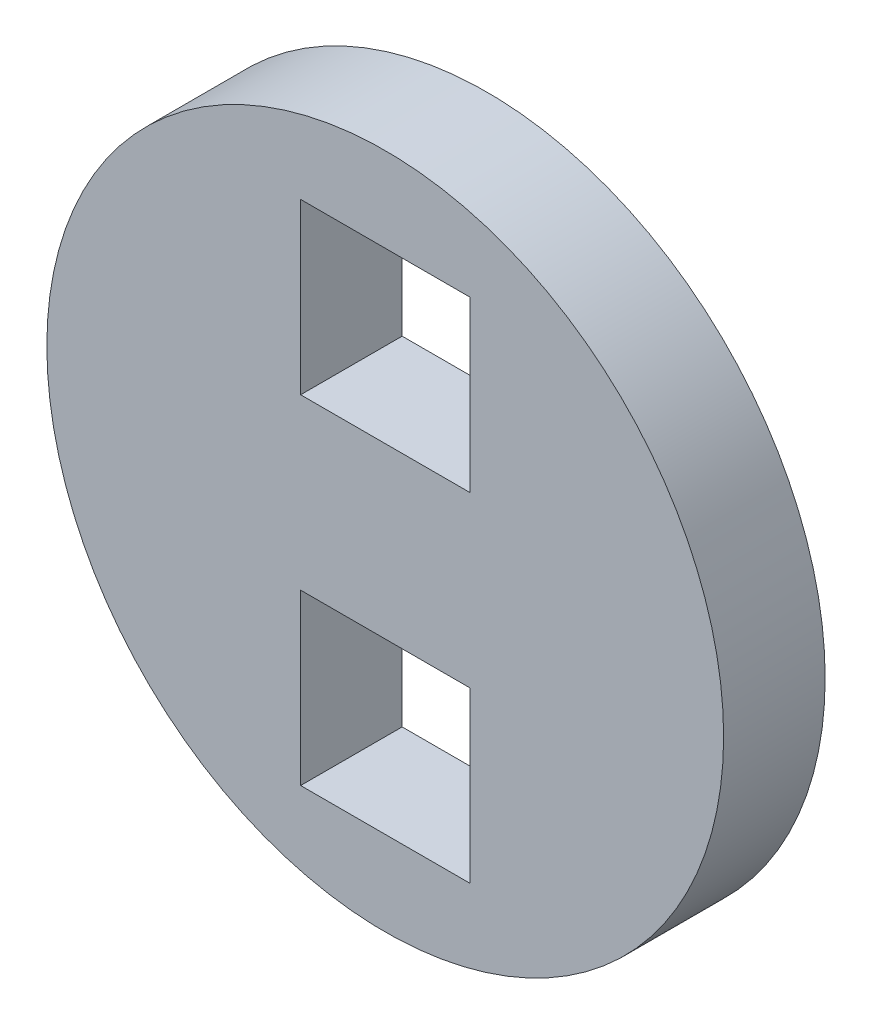
ISO-10303-21;
HEADER;
FILE_DESCRIPTION(('STEP AP214'),'2;1');
FILE_NAME('part.step','',(''),(''),'','','');
FILE_SCHEMA(('AUTOMOTIVE_DESIGN { 1 0 10303 214 1 1 1 1 }'));
ENDSEC;
DATA;
#1=APPLICATION_CONTEXT('core data for automotive mechanical design processes');
#2=APPLICATION_PROTOCOL_DEFINITION('international standard','automotive_design',2000,#1);
#3=PRODUCT_CONTEXT('',#1,'mechanical');
#4=PRODUCT('Part','Part','',(#3));
#5=PRODUCT_RELATED_PRODUCT_CATEGORY('part','',(#4));
#6=PRODUCT_DEFINITION_FORMATION('','',#4);
#7=PRODUCT_DEFINITION_CONTEXT('part definition',#1,'design');
#8=PRODUCT_DEFINITION('design','',#6,#7);
#9=PRODUCT_DEFINITION_SHAPE('','',#8);
#10=(LENGTH_UNIT() NAMED_UNIT(*) SI_UNIT(.MILLI.,.METRE.));
#11=(NAMED_UNIT(*) PLANE_ANGLE_UNIT() SI_UNIT($,.RADIAN.));
#12=(NAMED_UNIT(*) SI_UNIT($,.STERADIAN.) SOLID_ANGLE_UNIT());
#13=UNCERTAINTY_MEASURE_WITH_UNIT(LENGTH_MEASURE(1.E-05),#10,'distance_accuracy_value','');
#14=(GEOMETRIC_REPRESENTATION_CONTEXT(3) GLOBAL_UNCERTAINTY_ASSIGNED_CONTEXT((#13)) GLOBAL_UNIT_ASSIGNED_CONTEXT((#10,
#11,#12)) REPRESENTATION_CONTEXT('',''));
#15=CARTESIAN_POINT('',(0.,0.,0.));
#16=DIRECTION('',(0.,0.,1.));
#17=DIRECTION('',(1.,0.,0.));
#18=AXIS2_PLACEMENT_3D('',#15,#16,#17);
#19=CARTESIAN_POINT('',(0.,0.,3.));
#20=DIRECTION('',(0.,0.,1.));
#21=DIRECTION('',(1.,0.,0.));
#22=AXIS2_PLACEMENT_3D('',#19,#20,#21);
#23=PLANE('',#22);
#24=CARTESIAN_POINT('',(0.,0.,3.));
#25=DIRECTION('',(0.,0.,1.));
#26=DIRECTION('',(1.,0.,0.));
#27=AXIS2_PLACEMENT_3D('',#24,#25,#26);
#28=CIRCLE('',#27,10.);
#29=CARTESIAN_POINT('',(10.,0.,3.));
#30=VERTEX_POINT('',#29);
#31=EDGE_CURVE('E11',#30,#30,#28,.T.);
#32=ORIENTED_EDGE('',*,*,#31,.T.);
#33=EDGE_LOOP('',(#32));
#34=FACE_BOUND('',#33,.T.);
#35=DIRECTION('',(0.,-1.,0.));
#36=VECTOR('',#35,1.);
#37=CARTESIAN_POINT('',(-2.5,-2.5,3.));
#38=LINE('',#37,#36);
#39=CARTESIAN_POINT('',(-2.5,-2.5,3.));
#40=VERTEX_POINT('',#39);
#41=CARTESIAN_POINT('',(-2.5,-7.5,3.));
#42=VERTEX_POINT('',#41);
#43=EDGE_CURVE('E140',#40,#42,#38,.T.);
#44=ORIENTED_EDGE('',*,*,#43,.F.);
#45=DIRECTION('',(-1.,0.,0.));
#46=VECTOR('',#45,1.);
#47=CARTESIAN_POINT('',(-2.5,-2.5,3.));
#48=LINE('',#47,#46);
#49=CARTESIAN_POINT('',(2.5,-2.5,3.));
#50=VERTEX_POINT('',#49);
#51=EDGE_CURVE('E138',#50,#40,#48,.T.);
#52=ORIENTED_EDGE('',*,*,#51,.F.);
#53=DIRECTION('',(0.,1.,0.));
#54=VECTOR('',#53,1.);
#55=CARTESIAN_POINT('',(2.5,-2.5,3.));
#56=LINE('',#55,#54);
#57=CARTESIAN_POINT('',(2.5,-7.5,3.));
#58=VERTEX_POINT('',#57);
#59=EDGE_CURVE('E146',#58,#50,#56,.T.);
#60=ORIENTED_EDGE('',*,*,#59,.F.);
#61=DIRECTION('',(1.,0.,0.));
#62=VECTOR('',#61,1.);
#63=CARTESIAN_POINT('',(-2.5,-7.5,3.));
#64=LINE('',#63,#62);
#65=EDGE_CURVE('E143',#42,#58,#64,.T.);
#66=ORIENTED_EDGE('',*,*,#65,.F.);
#67=EDGE_LOOP('',(#44,#52,#60,#66));
#68=FACE_BOUND('',#67,.T.);
#69=DIRECTION('',(0.,1.,0.));
#70=VECTOR('',#69,1.);
#71=CARTESIAN_POINT('',(2.5,2.5,3.));
#72=LINE('',#71,#70);
#73=CARTESIAN_POINT('',(2.5,2.5,3.));
#74=VERTEX_POINT('',#73);
#75=CARTESIAN_POINT('',(2.5,7.5,3.));
#76=VERTEX_POINT('',#75);
#77=EDGE_CURVE('E110',#74,#76,#72,.T.);
#78=ORIENTED_EDGE('',*,*,#77,.F.);
#79=DIRECTION('',(1.,0.,0.));
#80=VECTOR('',#79,1.);
#81=CARTESIAN_POINT('',(-2.5,2.5,3.));
#82=LINE('',#81,#80);
#83=CARTESIAN_POINT('',(-2.5,2.5,3.));
#84=VERTEX_POINT('',#83);
#85=EDGE_CURVE('E102',#84,#74,#82,.T.);
#86=ORIENTED_EDGE('',*,*,#85,.F.);
#87=DIRECTION('',(0.,-1.,0.));
#88=VECTOR('',#87,1.);
#89=CARTESIAN_POINT('',(-2.5,2.5,3.));
#90=LINE('',#89,#88);
#91=CARTESIAN_POINT('',(-2.5,7.5,3.));
#92=VERTEX_POINT('',#91);
#93=EDGE_CURVE('E124',#92,#84,#90,.T.);
#94=ORIENTED_EDGE('',*,*,#93,.F.);
#95=DIRECTION('',(-1.,0.,0.));
#96=VECTOR('',#95,1.);
#97=CARTESIAN_POINT('',(-2.5,7.5,3.));
#98=LINE('',#97,#96);
#99=EDGE_CURVE('E122',#76,#92,#98,.T.);
#100=ORIENTED_EDGE('',*,*,#99,.F.);
#101=EDGE_LOOP('',(#78,#86,#94,#100));
#102=FACE_BOUND('',#101,.T.);
#103=ADVANCED_FACE('F37',(#34,#68,#102),#23,.T.);
#104=CARTESIAN_POINT('',(0.,0.,0.));
#105=DIRECTION('',(0.,0.,1.));
#106=DIRECTION('',(1.,0.,0.));
#107=AXIS2_PLACEMENT_3D('',#104,#105,#106);
#108=PLANE('',#107);
#109=DIRECTION('',(-1.,0.,0.));
#110=VECTOR('',#109,1.);
#111=CARTESIAN_POINT('',(-2.5,-2.5,0.));
#112=LINE('',#111,#110);
#113=CARTESIAN_POINT('',(2.5,-2.5,0.));
#114=VERTEX_POINT('',#113);
#115=CARTESIAN_POINT('',(-2.5,-2.5,0.));
#116=VERTEX_POINT('',#115);
#117=EDGE_CURVE('E118',#114,#116,#112,.T.);
#118=ORIENTED_EDGE('',*,*,#117,.T.);
#119=DIRECTION('',(0.,-1.,0.));
#120=VECTOR('',#119,1.);
#121=CARTESIAN_POINT('',(-2.5,-2.5,0.));
#122=LINE('',#121,#120);
#123=CARTESIAN_POINT('',(-2.5,-7.5,0.));
#124=VERTEX_POINT('',#123);
#125=EDGE_CURVE('E151',#116,#124,#122,.T.);
#126=ORIENTED_EDGE('',*,*,#125,.T.);
#127=DIRECTION('',(1.,0.,0.));
#128=VECTOR('',#127,1.);
#129=CARTESIAN_POINT('',(-2.5,-7.5,0.));
#130=LINE('',#129,#128);
#131=CARTESIAN_POINT('',(2.5,-7.5,0.));
#132=VERTEX_POINT('',#131);
#133=EDGE_CURVE('E154',#124,#132,#130,.T.);
#134=ORIENTED_EDGE('',*,*,#133,.T.);
#135=DIRECTION('',(0.,1.,0.));
#136=VECTOR('',#135,1.);
#137=CARTESIAN_POINT('',(2.5,-2.5,0.));
#138=LINE('',#137,#136);
#139=EDGE_CURVE('E141',#132,#114,#138,.T.);
#140=ORIENTED_EDGE('',*,*,#139,.T.);
#141=EDGE_LOOP('',(#118,#126,#134,#140));
#142=FACE_BOUND('',#141,.T.);
#143=CARTESIAN_POINT('',(0.,0.,0.));
#144=DIRECTION('',(0.,0.,1.));
#145=DIRECTION('',(1.,0.,0.));
#146=AXIS2_PLACEMENT_3D('',#143,#144,#145);
#147=CIRCLE('',#146,10.);
#148=CARTESIAN_POINT('',(10.,0.,0.));
#149=VERTEX_POINT('',#148);
#150=EDGE_CURVE('E41',#149,#149,#147,.T.);
#151=ORIENTED_EDGE('',*,*,#150,.F.);
#152=EDGE_LOOP('',(#151));
#153=FACE_BOUND('',#152,.T.);
#154=DIRECTION('',(1.,0.,0.));
#155=VECTOR('',#154,1.);
#156=CARTESIAN_POINT('',(-2.5,2.5,0.));
#157=LINE('',#156,#155);
#158=CARTESIAN_POINT('',(-2.5,2.5,0.));
#159=VERTEX_POINT('',#158);
#160=CARTESIAN_POINT('',(2.5,2.5,0.));
#161=VERTEX_POINT('',#160);
#162=EDGE_CURVE('E60',#159,#161,#157,.T.);
#163=ORIENTED_EDGE('',*,*,#162,.T.);
#164=DIRECTION('',(0.,1.,0.));
#165=VECTOR('',#164,1.);
#166=CARTESIAN_POINT('',(2.5,2.5,0.));
#167=LINE('',#166,#165);
#168=CARTESIAN_POINT('',(2.5,7.5,0.));
#169=VERTEX_POINT('',#168);
#170=EDGE_CURVE('E117',#161,#169,#167,.T.);
#171=ORIENTED_EDGE('',*,*,#170,.T.);
#172=DIRECTION('',(-1.,0.,0.));
#173=VECTOR('',#172,1.);
#174=CARTESIAN_POINT('',(-2.5,7.5,0.));
#175=LINE('',#174,#173);
#176=CARTESIAN_POINT('',(-2.5,7.5,0.));
#177=VERTEX_POINT('',#176);
#178=EDGE_CURVE('E130',#169,#177,#175,.T.);
#179=ORIENTED_EDGE('',*,*,#178,.T.);
#180=DIRECTION('',(0.,-1.,0.));
#181=VECTOR('',#180,1.);
#182=CARTESIAN_POINT('',(-2.5,2.5,0.));
#183=LINE('',#182,#181);
#184=EDGE_CURVE('E111',#177,#159,#183,.T.);
#185=ORIENTED_EDGE('',*,*,#184,.T.);
#186=EDGE_LOOP('',(#163,#171,#179,#185));
#187=FACE_BOUND('',#186,.T.);
#188=ADVANCED_FACE('F173',(#142,#153,#187),#108,.F.);
#189=CARTESIAN_POINT('',(0.,0.,3.));
#190=DIRECTION('',(0.,0.,-1.));
#191=DIRECTION('',(-1.,0.,0.));
#192=AXIS2_PLACEMENT_3D('',#189,#190,#191);
#193=CYLINDRICAL_SURFACE('',#192,10.);
#194=ORIENTED_EDGE('',*,*,#31,.F.);
#195=EDGE_LOOP('',(#194));
#196=FACE_BOUND('',#195,.T.);
#197=ORIENTED_EDGE('',*,*,#150,.T.);
#198=EDGE_LOOP('',(#197));
#199=FACE_BOUND('',#198,.T.);
#200=ADVANCED_FACE('F39',(#196,#199),#193,.T.);
#201=CARTESIAN_POINT('',(-2.5,-2.5,3.));
#202=DIRECTION('',(0.,-1.,0.));
#203=DIRECTION('',(1.,0.,0.));
#204=AXIS2_PLACEMENT_3D('',#201,#202,#203);
#205=PLANE('',#204);
#206=ORIENTED_EDGE('',*,*,#117,.F.);
#207=DIRECTION('',(0.,0.,-1.));
#208=VECTOR('',#207,1.);
#209=CARTESIAN_POINT('',(2.5,-2.5,3.));
#210=LINE('',#209,#208);
#211=EDGE_CURVE('E148',#50,#114,#210,.T.);
#212=ORIENTED_EDGE('',*,*,#211,.F.);
#213=ORIENTED_EDGE('',*,*,#51,.T.);
#214=DIRECTION('',(0.,0.,-1.));
#215=VECTOR('',#214,1.);
#216=CARTESIAN_POINT('',(-2.5,-2.5,3.));
#217=LINE('',#216,#215);
#218=EDGE_CURVE('E165',#40,#116,#217,.T.);
#219=ORIENTED_EDGE('',*,*,#218,.T.);
#220=EDGE_LOOP('',(#206,#212,#213,#219));
#221=FACE_BOUND('',#220,.T.);
#222=ADVANCED_FACE('F194',(#221),#205,.T.);
#223=CARTESIAN_POINT('',(-2.5,-2.5,3.));
#224=DIRECTION('',(1.,0.,0.));
#225=DIRECTION('',(0.,0.,-1.));
#226=AXIS2_PLACEMENT_3D('',#223,#224,#225);
#227=PLANE('',#226);
#228=ORIENTED_EDGE('',*,*,#125,.F.);
#229=ORIENTED_EDGE('',*,*,#218,.F.);
#230=ORIENTED_EDGE('',*,*,#43,.T.);
#231=DIRECTION('',(0.,0.,-1.));
#232=VECTOR('',#231,1.);
#233=CARTESIAN_POINT('',(-2.5,-7.5,3.));
#234=LINE('',#233,#232);
#235=EDGE_CURVE('E163',#42,#124,#234,.T.);
#236=ORIENTED_EDGE('',*,*,#235,.T.);
#237=EDGE_LOOP('',(#228,#229,#230,#236));
#238=FACE_BOUND('',#237,.T.);
#239=ADVANCED_FACE('F197',(#238),#227,.T.);
#240=CARTESIAN_POINT('',(-2.5,-7.5,3.));
#241=DIRECTION('',(0.,1.,0.));
#242=DIRECTION('',(0.,0.,1.));
#243=AXIS2_PLACEMENT_3D('',#240,#241,#242);
#244=PLANE('',#243);
#245=ORIENTED_EDGE('',*,*,#133,.F.);
#246=ORIENTED_EDGE('',*,*,#235,.F.);
#247=ORIENTED_EDGE('',*,*,#65,.T.);
#248=DIRECTION('',(0.,0.,-1.));
#249=VECTOR('',#248,1.);
#250=CARTESIAN_POINT('',(2.5,-7.5,3.));
#251=LINE('',#250,#249);
#252=EDGE_CURVE('E161',#58,#132,#251,.T.);
#253=ORIENTED_EDGE('',*,*,#252,.T.);
#254=EDGE_LOOP('',(#245,#246,#247,#253));
#255=FACE_BOUND('',#254,.T.);
#256=ADVANCED_FACE('F200',(#255),#244,.T.);
#257=CARTESIAN_POINT('',(2.5,-2.5,3.));
#258=DIRECTION('',(-1.,0.,0.));
#259=DIRECTION('',(0.,0.,1.));
#260=AXIS2_PLACEMENT_3D('',#257,#258,#259);
#261=PLANE('',#260);
#262=ORIENTED_EDGE('',*,*,#139,.F.);
#263=ORIENTED_EDGE('',*,*,#252,.F.);
#264=ORIENTED_EDGE('',*,*,#59,.T.);
#265=ORIENTED_EDGE('',*,*,#211,.T.);
#266=EDGE_LOOP('',(#262,#263,#264,#265));
#267=FACE_BOUND('',#266,.T.);
#268=ADVANCED_FACE('F204',(#267),#261,.T.);
#269=CARTESIAN_POINT('',(-2.5,2.5,3.));
#270=DIRECTION('',(0.,1.,0.));
#271=DIRECTION('',(0.,0.,1.));
#272=AXIS2_PLACEMENT_3D('',#269,#270,#271);
#273=PLANE('',#272);
#274=ORIENTED_EDGE('',*,*,#162,.F.);
#275=DIRECTION('',(0.,0.,-1.));
#276=VECTOR('',#275,1.);
#277=CARTESIAN_POINT('',(-2.5,2.5,3.));
#278=LINE('',#277,#276);
#279=EDGE_CURVE('E106',#84,#159,#278,.T.);
#280=ORIENTED_EDGE('',*,*,#279,.F.);
#281=ORIENTED_EDGE('',*,*,#85,.T.);
#282=DIRECTION('',(0.,0.,-1.));
#283=VECTOR('',#282,1.);
#284=CARTESIAN_POINT('',(2.5,2.5,3.));
#285=LINE('',#284,#283);
#286=EDGE_CURVE('E105',#74,#161,#285,.T.);
#287=ORIENTED_EDGE('',*,*,#286,.T.);
#288=EDGE_LOOP('',(#274,#280,#281,#287));
#289=FACE_BOUND('',#288,.T.);
#290=ADVANCED_FACE('F104',(#289),#273,.T.);
#291=CARTESIAN_POINT('',(2.5,2.5,3.));
#292=DIRECTION('',(-1.,0.,0.));
#293=DIRECTION('',(0.,-1.,0.));
#294=AXIS2_PLACEMENT_3D('',#291,#292,#293);
#295=PLANE('',#294);
#296=ORIENTED_EDGE('',*,*,#170,.F.);
#297=ORIENTED_EDGE('',*,*,#286,.F.);
#298=ORIENTED_EDGE('',*,*,#77,.T.);
#299=DIRECTION('',(0.,0.,-1.));
#300=VECTOR('',#299,1.);
#301=CARTESIAN_POINT('',(2.5,7.5,3.));
#302=LINE('',#301,#300);
#303=EDGE_CURVE('E119',#76,#169,#302,.T.);
#304=ORIENTED_EDGE('',*,*,#303,.T.);
#305=EDGE_LOOP('',(#296,#297,#298,#304));
#306=FACE_BOUND('',#305,.T.);
#307=ADVANCED_FACE('F114',(#306),#295,.T.);
#308=CARTESIAN_POINT('',(-2.5,7.5,3.));
#309=DIRECTION('',(0.,-1.,0.));
#310=DIRECTION('',(0.,0.,-1.));
#311=AXIS2_PLACEMENT_3D('',#308,#309,#310);
#312=PLANE('',#311);
#313=ORIENTED_EDGE('',*,*,#178,.F.);
#314=ORIENTED_EDGE('',*,*,#303,.F.);
#315=ORIENTED_EDGE('',*,*,#99,.T.);
#316=DIRECTION('',(0.,0.,-1.));
#317=VECTOR('',#316,1.);
#318=CARTESIAN_POINT('',(-2.5,7.5,3.));
#319=LINE('',#318,#317);
#320=EDGE_CURVE('E52',#92,#177,#319,.T.);
#321=ORIENTED_EDGE('',*,*,#320,.T.);
#322=EDGE_LOOP('',(#313,#314,#315,#321));
#323=FACE_BOUND('',#322,.T.);
#324=ADVANCED_FACE('F180',(#323),#312,.T.);
#325=CARTESIAN_POINT('',(-2.5,2.5,3.));
#326=DIRECTION('',(1.,0.,0.));
#327=DIRECTION('',(0.,0.,-1.));
#328=AXIS2_PLACEMENT_3D('',#325,#326,#327);
#329=PLANE('',#328);
#330=ORIENTED_EDGE('',*,*,#184,.F.);
#331=ORIENTED_EDGE('',*,*,#320,.F.);
#332=ORIENTED_EDGE('',*,*,#93,.T.);
#333=ORIENTED_EDGE('',*,*,#279,.T.);
#334=EDGE_LOOP('',(#330,#331,#332,#333));
#335=FACE_BOUND('',#334,.T.);
#336=ADVANCED_FACE('F178',(#335),#329,.T.);
#337=CLOSED_SHELL('',(#103,#188,#200,#222,#239,#256,#268,#290,#307,#324,#336));
#338=MANIFOLD_SOLID_BREP('B2',#337);
#339=ADVANCED_BREP_SHAPE_REPRESENTATION('',(#18,#338),#14);
#340=SHAPE_DEFINITION_REPRESENTATION(#9,#339);
ENDSEC;
END-ISO-10303-21;
